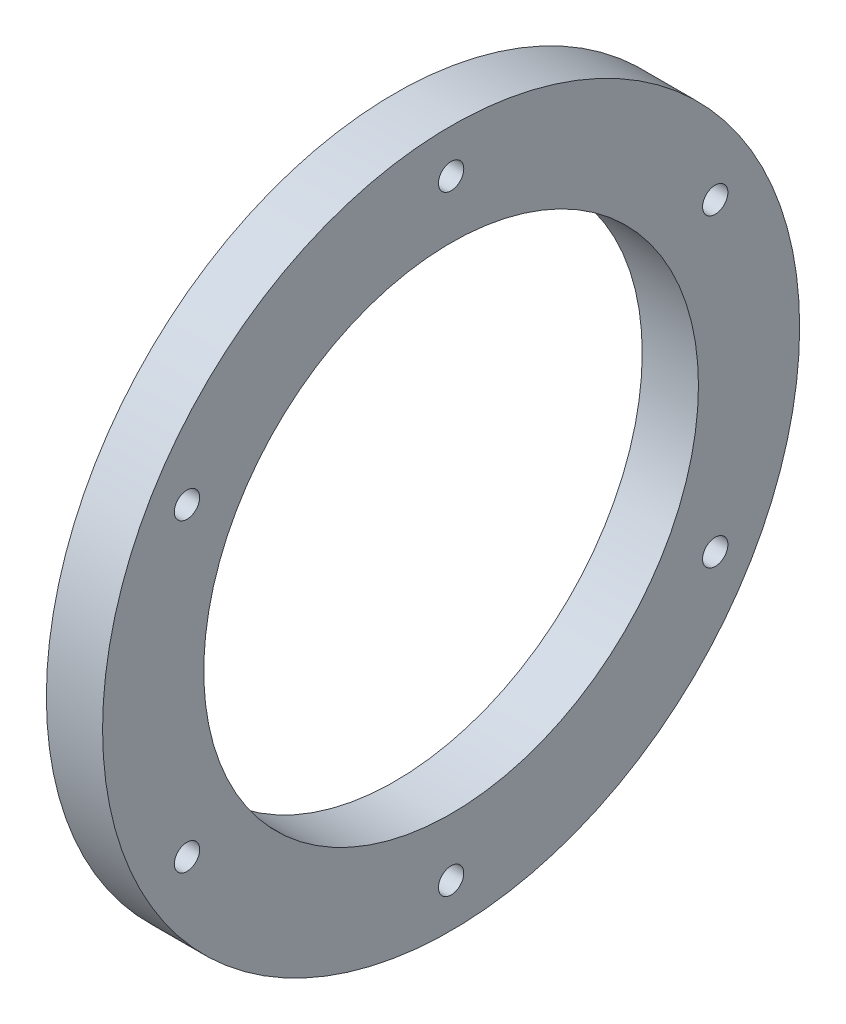
ISO-10303-21;
HEADER;
FILE_DESCRIPTION(('STEP AP214'),'2;1');
FILE_NAME('part.step','',(''),(''),'','','');
FILE_SCHEMA(('AUTOMOTIVE_DESIGN { 1 0 10303 214 1 1 1 1 }'));
ENDSEC;
DATA;
#1=APPLICATION_CONTEXT('core data for automotive mechanical design processes');
#2=APPLICATION_PROTOCOL_DEFINITION('international standard','automotive_design',2000,#1);
#3=PRODUCT_CONTEXT('',#1,'mechanical');
#4=PRODUCT('Part','Part','',(#3));
#5=PRODUCT_RELATED_PRODUCT_CATEGORY('part','',(#4));
#6=PRODUCT_DEFINITION_FORMATION('','',#4);
#7=PRODUCT_DEFINITION_CONTEXT('part definition',#1,'design');
#8=PRODUCT_DEFINITION('design','',#6,#7);
#9=PRODUCT_DEFINITION_SHAPE('','',#8);
#10=(LENGTH_UNIT() NAMED_UNIT(*) SI_UNIT(.MILLI.,.METRE.));
#11=(NAMED_UNIT(*) PLANE_ANGLE_UNIT() SI_UNIT($,.RADIAN.));
#12=(NAMED_UNIT(*) SI_UNIT($,.STERADIAN.) SOLID_ANGLE_UNIT());
#13=UNCERTAINTY_MEASURE_WITH_UNIT(LENGTH_MEASURE(1.E-05),#10,'distance_accuracy_value','');
#14=(GEOMETRIC_REPRESENTATION_CONTEXT(3) GLOBAL_UNCERTAINTY_ASSIGNED_CONTEXT((#13)) GLOBAL_UNIT_ASSIGNED_CONTEXT((#10,
#11,#12)) REPRESENTATION_CONTEXT('',''));
#15=CARTESIAN_POINT('',(0.,0.,0.));
#16=DIRECTION('',(0.,0.,1.));
#17=DIRECTION('',(1.,0.,0.));
#18=AXIS2_PLACEMENT_3D('',#15,#16,#17);
#19=CARTESIAN_POINT('',(5.,0.,0.));
#20=DIRECTION('',(1.,0.,0.));
#21=DIRECTION('',(0.,0.,-1.));
#22=AXIS2_PLACEMENT_3D('',#19,#20,#21);
#23=PLANE('',#22);
#24=CARTESIAN_POINT('',(5.,27.125,-46.9818781553058));
#25=DIRECTION('',(1.,0.,0.));
#26=DIRECTION('',(0.,0.,-1.));
#27=AXIS2_PLACEMENT_3D('',#24,#25,#26);
#28=CIRCLE('',#27,2.24999999999999);
#29=CARTESIAN_POINT('',(5.,27.125,-49.2318781553058));
#30=VERTEX_POINT('',#29);
#31=EDGE_CURVE('E88',#30,#30,#28,.T.);
#32=ORIENTED_EDGE('',*,*,#31,.F.);
#33=EDGE_LOOP('',(#32));
#34=FACE_BOUND('',#33,.T.);
#35=CARTESIAN_POINT('',(5.,-27.125,-46.9818781553058));
#36=DIRECTION('',(1.,0.,0.));
#37=DIRECTION('',(0.,0.,-1.));
#38=AXIS2_PLACEMENT_3D('',#35,#36,#37);
#39=CIRCLE('',#38,2.24999999999999);
#40=CARTESIAN_POINT('',(5.,-27.125,-49.2318781553058));
#41=VERTEX_POINT('',#40);
#42=EDGE_CURVE('E82',#41,#41,#39,.T.);
#43=ORIENTED_EDGE('',*,*,#42,.F.);
#44=EDGE_LOOP('',(#43));
#45=FACE_BOUND('',#44,.T.);
#46=CARTESIAN_POINT('',(5.,-54.25,0.));
#47=DIRECTION('',(1.,0.,0.));
#48=DIRECTION('',(0.,0.,-1.));
#49=AXIS2_PLACEMENT_3D('',#46,#47,#48);
#50=CIRCLE('',#49,2.24999999999999);
#51=CARTESIAN_POINT('',(5.,-54.25,-2.24999999999998));
#52=VERTEX_POINT('',#51);
#53=EDGE_CURVE('E76',#52,#52,#50,.T.);
#54=ORIENTED_EDGE('',*,*,#53,.F.);
#55=EDGE_LOOP('',(#54));
#56=FACE_BOUND('',#55,.T.);
#57=CARTESIAN_POINT('',(5.,-27.125,46.9818781553058));
#58=DIRECTION('',(1.,0.,0.));
#59=DIRECTION('',(0.,0.,-1.));
#60=AXIS2_PLACEMENT_3D('',#57,#58,#59);
#61=CIRCLE('',#60,2.24999999999999);
#62=CARTESIAN_POINT('',(5.,-27.125,44.7318781553058));
#63=VERTEX_POINT('',#62);
#64=EDGE_CURVE('E70',#63,#63,#61,.T.);
#65=ORIENTED_EDGE('',*,*,#64,.F.);
#66=EDGE_LOOP('',(#65));
#67=FACE_BOUND('',#66,.T.);
#68=CARTESIAN_POINT('',(5.,27.125,46.9818781553058));
#69=DIRECTION('',(1.,0.,0.));
#70=DIRECTION('',(0.,0.,-1.));
#71=AXIS2_PLACEMENT_3D('',#68,#69,#70);
#72=CIRCLE('',#71,2.24999999999999);
#73=CARTESIAN_POINT('',(5.,27.125,44.7318781553058));
#74=VERTEX_POINT('',#73);
#75=EDGE_CURVE('E64',#74,#74,#72,.T.);
#76=ORIENTED_EDGE('',*,*,#75,.F.);
#77=EDGE_LOOP('',(#76));
#78=FACE_BOUND('',#77,.T.);
#79=CARTESIAN_POINT('',(5.,54.25,0.));
#80=DIRECTION('',(1.,0.,0.));
#81=DIRECTION('',(0.,0.,-1.));
#82=AXIS2_PLACEMENT_3D('',#79,#80,#81);
#83=CIRCLE('',#82,2.24999999999999);
#84=CARTESIAN_POINT('',(5.,54.25,-2.24999999999999));
#85=VERTEX_POINT('',#84);
#86=EDGE_CURVE('E58',#85,#85,#83,.T.);
#87=ORIENTED_EDGE('',*,*,#86,.F.);
#88=EDGE_LOOP('',(#87));
#89=FACE_BOUND('',#88,.T.);
#90=CARTESIAN_POINT('',(5.,0.,0.));
#91=DIRECTION('',(1.,0.,0.));
#92=DIRECTION('',(0.,0.,-1.));
#93=AXIS2_PLACEMENT_3D('',#90,#91,#92);
#94=CIRCLE('',#93,62.);
#95=CARTESIAN_POINT('',(5.,0.,-62.));
#96=VERTEX_POINT('',#95);
#97=EDGE_CURVE('E10',#96,#96,#94,.T.);
#98=ORIENTED_EDGE('',*,*,#97,.T.);
#99=EDGE_LOOP('',(#98));
#100=FACE_BOUND('',#99,.T.);
#101=CARTESIAN_POINT('',(5.,0.,0.));
#102=DIRECTION('',(1.,0.,0.));
#103=DIRECTION('',(0.,0.,-1.));
#104=AXIS2_PLACEMENT_3D('',#101,#102,#103);
#105=CIRCLE('',#104,44.);
#106=CARTESIAN_POINT('',(5.,0.,-44.));
#107=VERTEX_POINT('',#106);
#108=EDGE_CURVE('E48',#107,#107,#105,.T.);
#109=ORIENTED_EDGE('',*,*,#108,.F.);
#110=EDGE_LOOP('',(#109));
#111=FACE_BOUND('',#110,.T.);
#112=ADVANCED_FACE('F37',(#34,#45,#56,#67,#78,#89,#100,#111),#23,.T.);
#113=CARTESIAN_POINT('',(-5.,0.,0.));
#114=DIRECTION('',(1.,0.,0.));
#115=DIRECTION('',(0.,0.,-1.));
#116=AXIS2_PLACEMENT_3D('',#113,#114,#115);
#117=PLANE('',#116);
#118=CARTESIAN_POINT('',(-4.99999999999999,27.125,-46.9818781553058));
#119=DIRECTION('',(1.,0.,0.));
#120=DIRECTION('',(0.,0.,-1.));
#121=AXIS2_PLACEMENT_3D('',#118,#119,#120);
#122=CIRCLE('',#121,2.24999999999999);
#123=CARTESIAN_POINT('',(-4.99999999999999,27.125,-49.2318781553058));
#124=VERTEX_POINT('',#123);
#125=EDGE_CURVE('E85',#124,#124,#122,.T.);
#126=ORIENTED_EDGE('',*,*,#125,.T.);
#127=EDGE_LOOP('',(#126));
#128=FACE_BOUND('',#127,.T.);
#129=CARTESIAN_POINT('',(-4.99999999999999,-27.125,-46.9818781553058));
#130=DIRECTION('',(1.,0.,0.));
#131=DIRECTION('',(0.,0.,-1.));
#132=AXIS2_PLACEMENT_3D('',#129,#130,#131);
#133=CIRCLE('',#132,2.24999999999999);
#134=CARTESIAN_POINT('',(-4.99999999999999,-27.125,-49.2318781553058));
#135=VERTEX_POINT('',#134);
#136=EDGE_CURVE('E79',#135,#135,#133,.T.);
#137=ORIENTED_EDGE('',*,*,#136,.T.);
#138=EDGE_LOOP('',(#137));
#139=FACE_BOUND('',#138,.T.);
#140=CARTESIAN_POINT('',(-4.99999999999999,-54.25,0.));
#141=DIRECTION('',(1.,0.,0.));
#142=DIRECTION('',(0.,0.,-1.));
#143=AXIS2_PLACEMENT_3D('',#140,#141,#142);
#144=CIRCLE('',#143,2.24999999999999);
#145=CARTESIAN_POINT('',(-4.99999999999999,-54.25,-2.24999999999998));
#146=VERTEX_POINT('',#145);
#147=EDGE_CURVE('E73',#146,#146,#144,.T.);
#148=ORIENTED_EDGE('',*,*,#147,.T.);
#149=EDGE_LOOP('',(#148));
#150=FACE_BOUND('',#149,.T.);
#151=CARTESIAN_POINT('',(-4.99999999999999,-27.125,46.9818781553058));
#152=DIRECTION('',(1.,0.,0.));
#153=DIRECTION('',(0.,0.,-1.));
#154=AXIS2_PLACEMENT_3D('',#151,#152,#153);
#155=CIRCLE('',#154,2.24999999999999);
#156=CARTESIAN_POINT('',(-4.99999999999999,-27.125,44.7318781553058));
#157=VERTEX_POINT('',#156);
#158=EDGE_CURVE('E67',#157,#157,#155,.T.);
#159=ORIENTED_EDGE('',*,*,#158,.T.);
#160=EDGE_LOOP('',(#159));
#161=FACE_BOUND('',#160,.T.);
#162=CARTESIAN_POINT('',(-4.99999999999999,27.125,46.9818781553058));
#163=DIRECTION('',(1.,0.,0.));
#164=DIRECTION('',(0.,0.,-1.));
#165=AXIS2_PLACEMENT_3D('',#162,#163,#164);
#166=CIRCLE('',#165,2.24999999999999);
#167=CARTESIAN_POINT('',(-4.99999999999999,27.125,44.7318781553058));
#168=VERTEX_POINT('',#167);
#169=EDGE_CURVE('E61',#168,#168,#166,.T.);
#170=ORIENTED_EDGE('',*,*,#169,.T.);
#171=EDGE_LOOP('',(#170));
#172=FACE_BOUND('',#171,.T.);
#173=CARTESIAN_POINT('',(-4.99999999999999,54.25,0.));
#174=DIRECTION('',(1.,0.,0.));
#175=DIRECTION('',(0.,0.,-1.));
#176=AXIS2_PLACEMENT_3D('',#173,#174,#175);
#177=CIRCLE('',#176,2.24999999999999);
#178=CARTESIAN_POINT('',(-4.99999999999999,54.25,-2.24999999999999));
#179=VERTEX_POINT('',#178);
#180=EDGE_CURVE('E53',#179,#179,#177,.T.);
#181=ORIENTED_EDGE('',*,*,#180,.T.);
#182=EDGE_LOOP('',(#181));
#183=FACE_BOUND('',#182,.T.);
#184=CARTESIAN_POINT('',(-5.,0.,0.));
#185=DIRECTION('',(1.,0.,0.));
#186=DIRECTION('',(0.,0.,-1.));
#187=AXIS2_PLACEMENT_3D('',#184,#185,#186);
#188=CIRCLE('',#187,62.);
#189=CARTESIAN_POINT('',(-5.,0.,-62.));
#190=VERTEX_POINT('',#189);
#191=EDGE_CURVE('E41',#190,#190,#188,.T.);
#192=ORIENTED_EDGE('',*,*,#191,.F.);
#193=EDGE_LOOP('',(#192));
#194=FACE_BOUND('',#193,.T.);
#195=CARTESIAN_POINT('',(-5.,0.,0.));
#196=DIRECTION('',(1.,0.,0.));
#197=DIRECTION('',(0.,0.,-1.));
#198=AXIS2_PLACEMENT_3D('',#195,#196,#197);
#199=CIRCLE('',#198,44.);
#200=CARTESIAN_POINT('',(-5.,0.,-44.));
#201=VERTEX_POINT('',#200);
#202=EDGE_CURVE('E50',#201,#201,#199,.T.);
#203=ORIENTED_EDGE('',*,*,#202,.T.);
#204=EDGE_LOOP('',(#203));
#205=FACE_BOUND('',#204,.T.);
#206=ADVANCED_FACE('F96',(#128,#139,#150,#161,#172,#183,#194,#205),#117,.F.);
#207=CARTESIAN_POINT('',(5.,0.,0.));
#208=DIRECTION('',(-1.,0.,0.));
#209=DIRECTION('',(0.,0.,1.));
#210=AXIS2_PLACEMENT_3D('',#207,#208,#209);
#211=CYLINDRICAL_SURFACE('',#210,62.);
#212=ORIENTED_EDGE('',*,*,#97,.F.);
#213=EDGE_LOOP('',(#212));
#214=FACE_BOUND('',#213,.T.);
#215=ORIENTED_EDGE('',*,*,#191,.T.);
#216=EDGE_LOOP('',(#215));
#217=FACE_BOUND('',#216,.T.);
#218=ADVANCED_FACE('F39',(#214,#217),#211,.T.);
#219=CARTESIAN_POINT('',(5.,0.,0.));
#220=DIRECTION('',(-1.,0.,0.));
#221=DIRECTION('',(0.,0.,1.));
#222=AXIS2_PLACEMENT_3D('',#219,#220,#221);
#223=CYLINDRICAL_SURFACE('',#222,44.);
#224=ORIENTED_EDGE('',*,*,#108,.T.);
#225=EDGE_LOOP('',(#224));
#226=FACE_BOUND('',#225,.T.);
#227=ORIENTED_EDGE('',*,*,#202,.F.);
#228=EDGE_LOOP('',(#227));
#229=FACE_BOUND('',#228,.T.);
#230=ADVANCED_FACE('F110',(#226,#229),#223,.F.);
#231=CARTESIAN_POINT('',(5.,54.25,0.));
#232=DIRECTION('',(1.,0.,0.));
#233=DIRECTION('',(0.,0.,-1.));
#234=AXIS2_PLACEMENT_3D('',#231,#232,#233);
#235=CYLINDRICAL_SURFACE('',#234,2.24999999999999);
#236=ORIENTED_EDGE('',*,*,#180,.F.);
#237=EDGE_LOOP('',(#236));
#238=FACE_BOUND('',#237,.T.);
#239=ORIENTED_EDGE('',*,*,#86,.T.);
#240=EDGE_LOOP('',(#239));
#241=FACE_BOUND('',#240,.T.);
#242=ADVANCED_FACE('F113',(#238,#241),#235,.F.);
#243=CARTESIAN_POINT('',(5.,27.125,46.9818781553058));
#244=DIRECTION('',(1.,0.,0.));
#245=DIRECTION('',(0.,0.,-1.));
#246=AXIS2_PLACEMENT_3D('',#243,#244,#245);
#247=CYLINDRICAL_SURFACE('',#246,2.24999999999999);
#248=ORIENTED_EDGE('',*,*,#169,.F.);
#249=EDGE_LOOP('',(#248));
#250=FACE_BOUND('',#249,.T.);
#251=ORIENTED_EDGE('',*,*,#75,.T.);
#252=EDGE_LOOP('',(#251));
#253=FACE_BOUND('',#252,.T.);
#254=ADVANCED_FACE('F128',(#250,#253),#247,.F.);
#255=CARTESIAN_POINT('',(5.,-27.125,46.9818781553058));
#256=DIRECTION('',(1.,0.,0.));
#257=DIRECTION('',(0.,0.,-1.));
#258=AXIS2_PLACEMENT_3D('',#255,#256,#257);
#259=CYLINDRICAL_SURFACE('',#258,2.24999999999999);
#260=ORIENTED_EDGE('',*,*,#158,.F.);
#261=EDGE_LOOP('',(#260));
#262=FACE_BOUND('',#261,.T.);
#263=ORIENTED_EDGE('',*,*,#64,.T.);
#264=EDGE_LOOP('',(#263));
#265=FACE_BOUND('',#264,.T.);
#266=ADVANCED_FACE('F131',(#262,#265),#259,.F.);
#267=CARTESIAN_POINT('',(5.,-54.25,0.));
#268=DIRECTION('',(1.,0.,0.));
#269=DIRECTION('',(0.,0.,-1.));
#270=AXIS2_PLACEMENT_3D('',#267,#268,#269);
#271=CYLINDRICAL_SURFACE('',#270,2.24999999999999);
#272=ORIENTED_EDGE('',*,*,#147,.F.);
#273=EDGE_LOOP('',(#272));
#274=FACE_BOUND('',#273,.T.);
#275=ORIENTED_EDGE('',*,*,#53,.T.);
#276=EDGE_LOOP('',(#275));
#277=FACE_BOUND('',#276,.T.);
#278=ADVANCED_FACE('F135',(#274,#277),#271,.F.);
#279=CARTESIAN_POINT('',(5.,-27.125,-46.9818781553058));
#280=DIRECTION('',(1.,0.,0.));
#281=DIRECTION('',(0.,0.,-1.));
#282=AXIS2_PLACEMENT_3D('',#279,#280,#281);
#283=CYLINDRICAL_SURFACE('',#282,2.24999999999999);
#284=ORIENTED_EDGE('',*,*,#136,.F.);
#285=EDGE_LOOP('',(#284));
#286=FACE_BOUND('',#285,.T.);
#287=ORIENTED_EDGE('',*,*,#42,.T.);
#288=EDGE_LOOP('',(#287));
#289=FACE_BOUND('',#288,.T.);
#290=ADVANCED_FACE('F139',(#286,#289),#283,.F.);
#291=CARTESIAN_POINT('',(5.,27.125,-46.9818781553058));
#292=DIRECTION('',(1.,0.,0.));
#293=DIRECTION('',(0.,0.,-1.));
#294=AXIS2_PLACEMENT_3D('',#291,#292,#293);
#295=CYLINDRICAL_SURFACE('',#294,2.24999999999999);
#296=ORIENTED_EDGE('',*,*,#125,.F.);
#297=EDGE_LOOP('',(#296));
#298=FACE_BOUND('',#297,.T.);
#299=ORIENTED_EDGE('',*,*,#31,.T.);
#300=EDGE_LOOP('',(#299));
#301=FACE_BOUND('',#300,.T.);
#302=ADVANCED_FACE('F92',(#298,#301),#295,.F.);
#303=CLOSED_SHELL('',(#112,#206,#218,#230,#242,#254,#266,#278,#290,#302));
#304=MANIFOLD_SOLID_BREP('B2',#303);
#305=ADVANCED_BREP_SHAPE_REPRESENTATION('',(#18,#304),#14);
#306=SHAPE_DEFINITION_REPRESENTATION(#9,#305);
ENDSEC;
END-ISO-10303-21;
